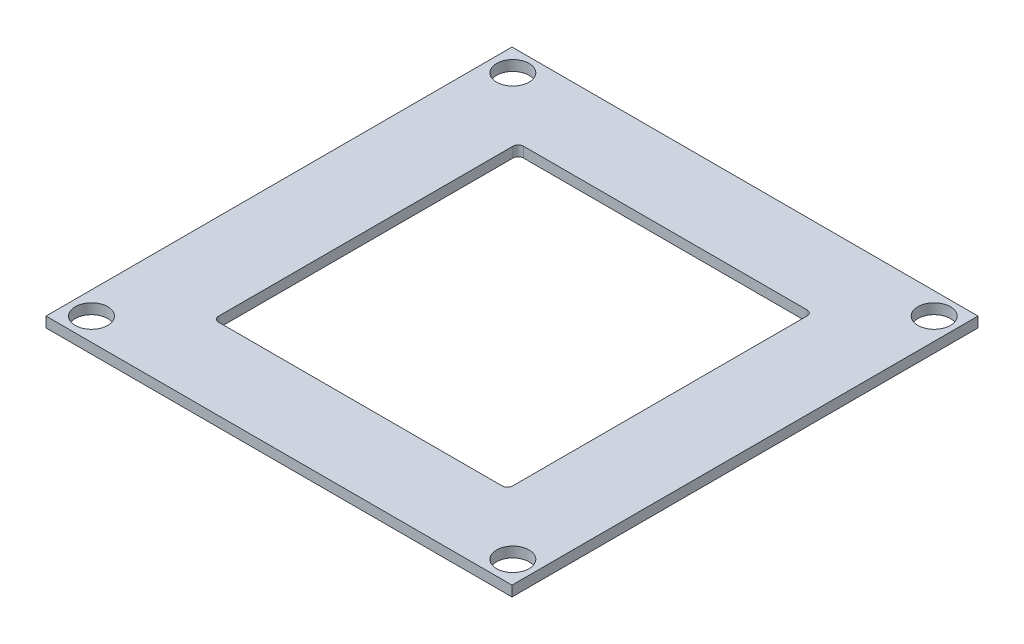
ISO-10303-21;
HEADER;
FILE_DESCRIPTION(('STEP AP214'),'2;1');
FILE_NAME('part.step','',(''),(''),'','','');
FILE_SCHEMA(('AUTOMOTIVE_DESIGN { 1 0 10303 214 1 1 1 1 }'));
ENDSEC;
DATA;
#1=APPLICATION_CONTEXT('core data for automotive mechanical design processes');
#2=APPLICATION_PROTOCOL_DEFINITION('international standard','automotive_design',2000,#1);
#3=PRODUCT_CONTEXT('',#1,'mechanical');
#4=PRODUCT('Part','Part','',(#3));
#5=PRODUCT_RELATED_PRODUCT_CATEGORY('part','',(#4));
#6=PRODUCT_DEFINITION_FORMATION('','',#4);
#7=PRODUCT_DEFINITION_CONTEXT('part definition',#1,'design');
#8=PRODUCT_DEFINITION('design','',#6,#7);
#9=PRODUCT_DEFINITION_SHAPE('','',#8);
#10=(LENGTH_UNIT() NAMED_UNIT(*) SI_UNIT(.MILLI.,.METRE.));
#11=(NAMED_UNIT(*) PLANE_ANGLE_UNIT() SI_UNIT($,.RADIAN.));
#12=(NAMED_UNIT(*) SI_UNIT($,.STERADIAN.) SOLID_ANGLE_UNIT());
#13=UNCERTAINTY_MEASURE_WITH_UNIT(LENGTH_MEASURE(1.E-05),#10,'distance_accuracy_value','');
#14=(GEOMETRIC_REPRESENTATION_CONTEXT(3) GLOBAL_UNCERTAINTY_ASSIGNED_CONTEXT((#13)) GLOBAL_UNIT_ASSIGNED_CONTEXT((#10,
#11,#12)) REPRESENTATION_CONTEXT('',''));
#15=CARTESIAN_POINT('',(0.,0.,0.));
#16=DIRECTION('',(0.,0.,1.));
#17=DIRECTION('',(1.,0.,0.));
#18=AXIS2_PLACEMENT_3D('',#15,#16,#17);
#19=CARTESIAN_POINT('',(0.,6.35,143.395999974));
#20=DIRECTION('',(1.,0.,0.));
#21=DIRECTION('',(0.,0.,-1.));
#22=AXIS2_PLACEMENT_3D('',#19,#20,#21);
#23=PLANE('',#22);
#24=DIRECTION('',(0.,0.,1.));
#25=VECTOR('',#24,1.);
#26=CARTESIAN_POINT('',(0.,0.,143.395999974));
#27=LINE('',#26,#25);
#28=CARTESIAN_POINT('',(0.,0.,-143.395999974));
#29=VERTEX_POINT('',#28);
#30=CARTESIAN_POINT('',(0.,0.,143.395999974));
#31=VERTEX_POINT('',#30);
#32=EDGE_CURVE('E155',#29,#31,#27,.T.);
#33=ORIENTED_EDGE('',*,*,#32,.T.);
#34=DIRECTION('',(0.,-1.,0.));
#35=VECTOR('',#34,1.);
#36=CARTESIAN_POINT('',(0.,6.35,143.395999974));
#37=LINE('',#36,#35);
#38=CARTESIAN_POINT('',(0.,6.35,143.395999974));
#39=VERTEX_POINT('',#38);
#40=EDGE_CURVE('E134',#39,#31,#37,.T.);
#41=ORIENTED_EDGE('',*,*,#40,.F.);
#42=DIRECTION('',(0.,0.,1.));
#43=VECTOR('',#42,1.);
#44=CARTESIAN_POINT('',(0.,6.35,143.395999974));
#45=LINE('',#44,#43);
#46=CARTESIAN_POINT('',(0.,6.35,-143.395999974));
#47=VERTEX_POINT('',#46);
#48=EDGE_CURVE('E142',#47,#39,#45,.T.);
#49=ORIENTED_EDGE('',*,*,#48,.F.);
#50=DIRECTION('',(0.,-1.,0.));
#51=VECTOR('',#50,1.);
#52=CARTESIAN_POINT('',(0.,6.35,-143.395999974));
#53=LINE('',#52,#51);
#54=EDGE_CURVE('E269',#47,#29,#53,.T.);
#55=ORIENTED_EDGE('',*,*,#54,.T.);
#56=EDGE_LOOP('',(#33,#41,#49,#55));
#57=FACE_BOUND('',#56,.T.);
#58=ADVANCED_FACE('F39',(#57),#23,.F.);
#59=CARTESIAN_POINT('',(0.,6.35,143.395999974));
#60=DIRECTION('',(0.,0.,-1.));
#61=DIRECTION('',(-1.,0.,0.));
#62=AXIS2_PLACEMENT_3D('',#59,#60,#61);
#63=PLANE('',#62);
#64=DIRECTION('',(1.,0.,0.));
#65=VECTOR('',#64,1.);
#66=CARTESIAN_POINT('',(0.,0.,143.395999974));
#67=LINE('',#66,#65);
#68=CARTESIAN_POINT('',(286.791999948,0.,143.395999974));
#69=VERTEX_POINT('',#68);
#70=EDGE_CURVE('E272',#31,#69,#67,.T.);
#71=ORIENTED_EDGE('',*,*,#70,.T.);
#72=DIRECTION('',(0.,-1.,0.));
#73=VECTOR('',#72,1.);
#74=CARTESIAN_POINT('',(286.791999948,6.35,143.395999974));
#75=LINE('',#74,#73);
#76=CARTESIAN_POINT('',(286.791999948,6.35,143.395999974));
#77=VERTEX_POINT('',#76);
#78=EDGE_CURVE('E137',#77,#69,#75,.T.);
#79=ORIENTED_EDGE('',*,*,#78,.F.);
#80=DIRECTION('',(1.,0.,0.));
#81=VECTOR('',#80,1.);
#82=CARTESIAN_POINT('',(0.,6.35,143.395999974));
#83=LINE('',#82,#81);
#84=EDGE_CURVE('E130',#39,#77,#83,.T.);
#85=ORIENTED_EDGE('',*,*,#84,.F.);
#86=ORIENTED_EDGE('',*,*,#40,.T.);
#87=EDGE_LOOP('',(#71,#79,#85,#86));
#88=FACE_BOUND('',#87,.T.);
#89=ADVANCED_FACE('F132',(#88),#63,.F.);
#90=CARTESIAN_POINT('',(286.791999948,6.35,143.395999974));
#91=DIRECTION('',(-1.,0.,0.));
#92=DIRECTION('',(0.,0.,1.));
#93=AXIS2_PLACEMENT_3D('',#90,#91,#92);
#94=PLANE('',#93);
#95=DIRECTION('',(0.,0.,-1.));
#96=VECTOR('',#95,1.);
#97=CARTESIAN_POINT('',(286.791999948,0.,143.395999974));
#98=LINE('',#97,#96);
#99=CARTESIAN_POINT('',(286.791999948,0.,-143.395999974));
#100=VERTEX_POINT('',#99);
#101=EDGE_CURVE('E275',#69,#100,#98,.T.);
#102=ORIENTED_EDGE('',*,*,#101,.T.);
#103=DIRECTION('',(0.,-1.,0.));
#104=VECTOR('',#103,1.);
#105=CARTESIAN_POINT('',(286.791999948,6.35,-143.395999974));
#106=LINE('',#105,#104);
#107=CARTESIAN_POINT('',(286.791999948,6.35,-143.395999974));
#108=VERTEX_POINT('',#107);
#109=EDGE_CURVE('E163',#108,#100,#106,.T.);
#110=ORIENTED_EDGE('',*,*,#109,.F.);
#111=DIRECTION('',(0.,0.,-1.));
#112=VECTOR('',#111,1.);
#113=CARTESIAN_POINT('',(286.791999948,6.35,143.395999974));
#114=LINE('',#113,#112);
#115=EDGE_CURVE('E141',#77,#108,#114,.T.);
#116=ORIENTED_EDGE('',*,*,#115,.F.);
#117=ORIENTED_EDGE('',*,*,#78,.T.);
#118=EDGE_LOOP('',(#102,#110,#116,#117));
#119=FACE_BOUND('',#118,.T.);
#120=ADVANCED_FACE('F290',(#119),#94,.F.);
#121=CARTESIAN_POINT('',(0.,6.35,-143.395999974));
#122=DIRECTION('',(0.,0.,1.));
#123=DIRECTION('',(1.,0.,0.));
#124=AXIS2_PLACEMENT_3D('',#121,#122,#123);
#125=PLANE('',#124);
#126=DIRECTION('',(-1.,0.,0.));
#127=VECTOR('',#126,1.);
#128=CARTESIAN_POINT('',(0.,0.,-143.395999974));
#129=LINE('',#128,#127);
#130=EDGE_CURVE('E152',#100,#29,#129,.T.);
#131=ORIENTED_EDGE('',*,*,#130,.T.);
#132=ORIENTED_EDGE('',*,*,#54,.F.);
#133=DIRECTION('',(-1.,0.,0.));
#134=VECTOR('',#133,1.);
#135=CARTESIAN_POINT('',(0.,6.35,-143.395999974));
#136=LINE('',#135,#134);
#137=EDGE_CURVE('E147',#108,#47,#136,.T.);
#138=ORIENTED_EDGE('',*,*,#137,.F.);
#139=ORIENTED_EDGE('',*,*,#109,.T.);
#140=EDGE_LOOP('',(#131,#132,#138,#139));
#141=FACE_BOUND('',#140,.T.);
#142=ADVANCED_FACE('F286',(#141),#125,.F.);
#143=CARTESIAN_POINT('',(0.,6.35,0.));
#144=DIRECTION('',(0.,-1.,0.));
#145=DIRECTION('',(0.,0.,-1.));
#146=AXIS2_PLACEMENT_3D('',#143,#144,#145);
#147=PLANE('',#146);
#148=DIRECTION('',(0.,0.,1.));
#149=VECTOR('',#148,1.);
#150=CARTESIAN_POINT('',(234.139965981564,6.35,93.569716007567));
#151=LINE('',#150,#149);
#152=CARTESIAN_POINT('',(234.139965981564,6.35,-90.9027160075705));
#153=VERTEX_POINT('',#152);
#154=CARTESIAN_POINT('',(234.139965981564,6.35,90.394716007567));
#155=VERTEX_POINT('',#154);
#156=EDGE_CURVE('E237',#153,#155,#151,.T.);
#157=ORIENTED_EDGE('',*,*,#156,.T.);
#158=CARTESIAN_POINT('',(230.964965981564,6.35,90.394716007567));
#159=DIRECTION('',(0.,-1.,0.));
#160=DIRECTION('',(0.,0.,-1.));
#161=AXIS2_PLACEMENT_3D('',#158,#159,#160);
#162=CIRCLE('',#161,3.175);
#163=CARTESIAN_POINT('',(230.964965981564,6.35,93.569716007567));
#164=VERTEX_POINT('',#163);
#165=EDGE_CURVE('E62',#155,#164,#162,.T.);
#166=ORIENTED_EDGE('',*,*,#165,.T.);
#167=DIRECTION('',(-1.,0.,0.));
#168=VECTOR('',#167,1.);
#169=CARTESIAN_POINT('',(234.139965981564,6.35,93.569716007567));
#170=LINE('',#169,#168);
#171=CARTESIAN_POINT('',(56.3350339664346,6.35,93.569716007567));
#172=VERTEX_POINT('',#171);
#173=EDGE_CURVE('E228',#164,#172,#170,.T.);
#174=ORIENTED_EDGE('',*,*,#173,.T.);
#175=CARTESIAN_POINT('',(56.3350339664345,6.35,90.394716007567));
#176=DIRECTION('',(0.,-1.,0.));
#177=DIRECTION('',(0.,0.,-1.));
#178=AXIS2_PLACEMENT_3D('',#175,#176,#177);
#179=CIRCLE('',#178,3.175);
#180=CARTESIAN_POINT('',(53.1600339664345,6.35,90.394716007567));
#181=VERTEX_POINT('',#180);
#182=EDGE_CURVE('E11',#172,#181,#179,.T.);
#183=ORIENTED_EDGE('',*,*,#182,.T.);
#184=DIRECTION('',(0.,0.,-1.));
#185=VECTOR('',#184,1.);
#186=CARTESIAN_POINT('',(53.1600339664345,6.35,93.569716007567));
#187=LINE('',#186,#185);
#188=CARTESIAN_POINT('',(53.1600339664345,6.35,-90.9027160075705));
#189=VERTEX_POINT('',#188);
#190=EDGE_CURVE('E220',#181,#189,#187,.T.);
#191=ORIENTED_EDGE('',*,*,#190,.T.);
#192=CARTESIAN_POINT('',(56.3350339664346,6.35,-90.9027160075704));
#193=DIRECTION('',(0.,-1.,0.));
#194=DIRECTION('',(0.,0.,-1.));
#195=AXIS2_PLACEMENT_3D('',#192,#193,#194);
#196=CIRCLE('',#195,3.175);
#197=CARTESIAN_POINT('',(56.3350339664346,6.35,-94.0777160075704));
#198=VERTEX_POINT('',#197);
#199=EDGE_CURVE('E193',#189,#198,#196,.T.);
#200=ORIENTED_EDGE('',*,*,#199,.T.);
#201=DIRECTION('',(1.,0.,0.));
#202=VECTOR('',#201,1.);
#203=CARTESIAN_POINT('',(234.139965981564,6.35,-94.0777160075704));
#204=LINE('',#203,#202);
#205=CARTESIAN_POINT('',(230.964965981564,6.35,-94.0777160075704));
#206=VERTEX_POINT('',#205);
#207=EDGE_CURVE('E233',#198,#206,#204,.T.);
#208=ORIENTED_EDGE('',*,*,#207,.T.);
#209=CARTESIAN_POINT('',(230.964965981564,6.35,-90.9027160075705));
#210=DIRECTION('',(0.,-1.,0.));
#211=DIRECTION('',(0.,0.,-1.));
#212=AXIS2_PLACEMENT_3D('',#209,#210,#211);
#213=CIRCLE('',#212,3.175);
#214=EDGE_CURVE('E199',#206,#153,#213,.T.);
#215=ORIENTED_EDGE('',*,*,#214,.T.);
#216=EDGE_LOOP('',(#157,#166,#174,#183,#191,#200,#208,#215));
#217=FACE_BOUND('',#216,.T.);
#218=CARTESIAN_POINT('',(273.299999947994,6.35,129.395999974));
#219=DIRECTION('',(0.,-1.,0.));
#220=DIRECTION('',(0.,0.,-1.));
#221=AXIS2_PLACEMENT_3D('',#218,#219,#220);
#222=CIRCLE('',#221,9.99999999999998);
#223=CARTESIAN_POINT('',(273.299999947994,6.35,119.395999974));
#224=VERTEX_POINT('',#223);
#225=EDGE_CURVE('E463',#224,#224,#222,.T.);
#226=ORIENTED_EDGE('',*,*,#225,.T.);
#227=EDGE_LOOP('',(#226));
#228=FACE_BOUND('',#227,.T.);
#229=CARTESIAN_POINT('',(13.9999999999966,6.35,129.395999973995));
#230=DIRECTION('',(0.,-1.,0.));
#231=DIRECTION('',(0.,0.,-1.));
#232=AXIS2_PLACEMENT_3D('',#229,#230,#231);
#233=CIRCLE('',#232,9.99999999999651);
#234=CARTESIAN_POINT('',(13.9999999999966,6.35,119.395999973999));
#235=VERTEX_POINT('',#234);
#236=EDGE_CURVE('E471',#235,#235,#233,.T.);
#237=ORIENTED_EDGE('',*,*,#236,.T.);
#238=EDGE_LOOP('',(#237));
#239=FACE_BOUND('',#238,.T.);
#240=CARTESIAN_POINT('',(14.0000000000022,6.35,-129.903999974005));
#241=DIRECTION('',(0.,-1.,0.));
#242=DIRECTION('',(0.,0.,-1.));
#243=AXIS2_PLACEMENT_3D('',#240,#241,#242);
#244=CIRCLE('',#243,9.99999999999718);
#245=CARTESIAN_POINT('',(14.0000000000022,6.35,-139.903999974002));
#246=VERTEX_POINT('',#245);
#247=EDGE_CURVE('E263',#246,#246,#244,.T.);
#248=ORIENTED_EDGE('',*,*,#247,.T.);
#249=EDGE_LOOP('',(#248));
#250=FACE_BOUND('',#249,.T.);
#251=CARTESIAN_POINT('',(273.299999948002,6.35,-129.903999973999));
#252=DIRECTION('',(0.,-1.,0.));
#253=DIRECTION('',(0.,0.,-1.));
#254=AXIS2_PLACEMENT_3D('',#251,#252,#253);
#255=CIRCLE('',#254,10.);
#256=CARTESIAN_POINT('',(273.299999948002,6.35,-139.903999973999));
#257=VERTEX_POINT('',#256);
#258=EDGE_CURVE('E256',#257,#257,#255,.T.);
#259=ORIENTED_EDGE('',*,*,#258,.T.);
#260=EDGE_LOOP('',(#259));
#261=FACE_BOUND('',#260,.T.);
#262=ORIENTED_EDGE('',*,*,#48,.T.);
#263=ORIENTED_EDGE('',*,*,#84,.T.);
#264=ORIENTED_EDGE('',*,*,#115,.T.);
#265=ORIENTED_EDGE('',*,*,#137,.T.);
#266=EDGE_LOOP('',(#262,#263,#264,#265));
#267=FACE_BOUND('',#266,.T.);
#268=ADVANCED_FACE('F145',(#217,#228,#239,#250,#261,#267),#147,.F.);
#269=CARTESIAN_POINT('',(0.,0.,0.));
#270=DIRECTION('',(0.,-1.,0.));
#271=DIRECTION('',(0.,0.,-1.));
#272=AXIS2_PLACEMENT_3D('',#269,#270,#271);
#273=PLANE('',#272);
#274=DIRECTION('',(0.,0.,-1.));
#275=VECTOR('',#274,1.);
#276=CARTESIAN_POINT('',(53.1600339664345,0.,93.569716007567));
#277=LINE('',#276,#275);
#278=CARTESIAN_POINT('',(53.1600339664345,0.,90.394716007567));
#279=VERTEX_POINT('',#278);
#280=CARTESIAN_POINT('',(53.1600339664345,0.,-90.9027160075705));
#281=VERTEX_POINT('',#280);
#282=EDGE_CURVE('E214',#279,#281,#277,.T.);
#283=ORIENTED_EDGE('',*,*,#282,.F.);
#284=CARTESIAN_POINT('',(56.3350339664345,0.,90.394716007567));
#285=DIRECTION('',(0.,-1.,0.));
#286=DIRECTION('',(0.,0.,-1.));
#287=AXIS2_PLACEMENT_3D('',#284,#285,#286);
#288=CIRCLE('',#287,3.175);
#289=CARTESIAN_POINT('',(56.3350339664346,0.,93.569716007567));
#290=VERTEX_POINT('',#289);
#291=EDGE_CURVE('E48',#279,#290,#288,.F.);
#292=ORIENTED_EDGE('',*,*,#291,.T.);
#293=DIRECTION('',(-1.,0.,0.));
#294=VECTOR('',#293,1.);
#295=CARTESIAN_POINT('',(234.139965981564,0.,93.569716007567));
#296=LINE('',#295,#294);
#297=CARTESIAN_POINT('',(230.964965981564,0.,93.569716007567));
#298=VERTEX_POINT('',#297);
#299=EDGE_CURVE('E212',#298,#290,#296,.T.);
#300=ORIENTED_EDGE('',*,*,#299,.F.);
#301=CARTESIAN_POINT('',(230.964965981564,0.,90.394716007567));
#302=DIRECTION('',(0.,-1.,0.));
#303=DIRECTION('',(0.,0.,-1.));
#304=AXIS2_PLACEMENT_3D('',#301,#302,#303);
#305=CIRCLE('',#304,3.175);
#306=CARTESIAN_POINT('',(234.139965981564,0.,90.394716007567));
#307=VERTEX_POINT('',#306);
#308=EDGE_CURVE('E202',#298,#307,#305,.F.);
#309=ORIENTED_EDGE('',*,*,#308,.T.);
#310=DIRECTION('',(0.,0.,1.));
#311=VECTOR('',#310,1.);
#312=CARTESIAN_POINT('',(234.139965981564,0.,93.569716007567));
#313=LINE('',#312,#311);
#314=CARTESIAN_POINT('',(234.139965981564,0.,-90.9027160075705));
#315=VERTEX_POINT('',#314);
#316=EDGE_CURVE('E221',#315,#307,#313,.T.);
#317=ORIENTED_EDGE('',*,*,#316,.F.);
#318=CARTESIAN_POINT('',(230.964965981564,0.,-90.9027160075705));
#319=DIRECTION('',(0.,-1.,0.));
#320=DIRECTION('',(0.,0.,-1.));
#321=AXIS2_PLACEMENT_3D('',#318,#319,#320);
#322=CIRCLE('',#321,3.175);
#323=CARTESIAN_POINT('',(230.964965981564,0.,-94.0777160075704));
#324=VERTEX_POINT('',#323);
#325=EDGE_CURVE('E196',#315,#324,#322,.F.);
#326=ORIENTED_EDGE('',*,*,#325,.T.);
#327=DIRECTION('',(1.,0.,0.));
#328=VECTOR('',#327,1.);
#329=CARTESIAN_POINT('',(234.139965981564,0.,-94.0777160075704));
#330=LINE('',#329,#328);
#331=CARTESIAN_POINT('',(56.3350339664346,0.,-94.0777160075704));
#332=VERTEX_POINT('',#331);
#333=EDGE_CURVE('E249',#332,#324,#330,.T.);
#334=ORIENTED_EDGE('',*,*,#333,.F.);
#335=CARTESIAN_POINT('',(56.3350339664346,0.,-90.9027160075704));
#336=DIRECTION('',(0.,-1.,0.));
#337=DIRECTION('',(0.,0.,-1.));
#338=AXIS2_PLACEMENT_3D('',#335,#336,#337);
#339=CIRCLE('',#338,3.175);
#340=EDGE_CURVE('E190',#332,#281,#339,.F.);
#341=ORIENTED_EDGE('',*,*,#340,.T.);
#342=EDGE_LOOP('',(#283,#292,#300,#309,#317,#326,#334,#341));
#343=FACE_BOUND('',#342,.T.);
#344=CARTESIAN_POINT('',(273.299999947994,0.,129.395999974));
#345=DIRECTION('',(0.,-1.,0.));
#346=DIRECTION('',(0.,0.,-1.));
#347=AXIS2_PLACEMENT_3D('',#344,#345,#346);
#348=CIRCLE('',#347,9.99999999999998);
#349=CARTESIAN_POINT('',(273.299999947994,0.,119.395999974));
#350=VERTEX_POINT('',#349);
#351=EDGE_CURVE('E240',#350,#350,#348,.T.);
#352=ORIENTED_EDGE('',*,*,#351,.F.);
#353=EDGE_LOOP('',(#352));
#354=FACE_BOUND('',#353,.T.);
#355=CARTESIAN_POINT('',(13.9999999999966,0.,129.395999973995));
#356=DIRECTION('',(0.,-1.,0.));
#357=DIRECTION('',(0.,0.,-1.));
#358=AXIS2_PLACEMENT_3D('',#355,#356,#357);
#359=CIRCLE('',#358,9.99999999999651);
#360=CARTESIAN_POINT('',(13.9999999999966,0.,119.395999973999));
#361=VERTEX_POINT('',#360);
#362=EDGE_CURVE('E468',#361,#361,#359,.T.);
#363=ORIENTED_EDGE('',*,*,#362,.F.);
#364=EDGE_LOOP('',(#363));
#365=FACE_BOUND('',#364,.T.);
#366=CARTESIAN_POINT('',(14.0000000000022,0.,-129.903999974005));
#367=DIRECTION('',(0.,-1.,0.));
#368=DIRECTION('',(0.,0.,-1.));
#369=AXIS2_PLACEMENT_3D('',#366,#367,#368);
#370=CIRCLE('',#369,9.99999999999718);
#371=CARTESIAN_POINT('',(14.0000000000022,0.,-139.903999974002));
#372=VERTEX_POINT('',#371);
#373=EDGE_CURVE('E477',#372,#372,#370,.T.);
#374=ORIENTED_EDGE('',*,*,#373,.F.);
#375=EDGE_LOOP('',(#374));
#376=FACE_BOUND('',#375,.T.);
#377=CARTESIAN_POINT('',(273.299999948002,0.,-129.903999973999));
#378=DIRECTION('',(0.,-1.,0.));
#379=DIRECTION('',(0.,0.,-1.));
#380=AXIS2_PLACEMENT_3D('',#377,#378,#379);
#381=CIRCLE('',#380,10.);
#382=CARTESIAN_POINT('',(273.299999948002,0.,-139.903999973999));
#383=VERTEX_POINT('',#382);
#384=EDGE_CURVE('E260',#383,#383,#381,.T.);
#385=ORIENTED_EDGE('',*,*,#384,.F.);
#386=EDGE_LOOP('',(#385));
#387=FACE_BOUND('',#386,.T.);
#388=ORIENTED_EDGE('',*,*,#32,.F.);
#389=ORIENTED_EDGE('',*,*,#130,.F.);
#390=ORIENTED_EDGE('',*,*,#101,.F.);
#391=ORIENTED_EDGE('',*,*,#70,.F.);
#392=EDGE_LOOP('',(#388,#389,#390,#391));
#393=FACE_BOUND('',#392,.T.);
#394=ADVANCED_FACE('F210',(#343,#354,#365,#376,#387,#393),#273,.T.);
#395=CARTESIAN_POINT('',(273.299999948002,6.35,-129.903999973999));
#396=DIRECTION('',(0.,-1.,0.));
#397=DIRECTION('',(0.,0.,-1.));
#398=AXIS2_PLACEMENT_3D('',#395,#396,#397);
#399=CYLINDRICAL_SURFACE('',#398,10.);
#400=ORIENTED_EDGE('',*,*,#258,.F.);
#401=EDGE_LOOP('',(#400));
#402=FACE_BOUND('',#401,.T.);
#403=ORIENTED_EDGE('',*,*,#384,.T.);
#404=EDGE_LOOP('',(#403));
#405=FACE_BOUND('',#404,.T.);
#406=ADVANCED_FACE('F341',(#402,#405),#399,.F.);
#407=CARTESIAN_POINT('',(14.0000000000022,6.35,-129.903999974005));
#408=DIRECTION('',(0.,-1.,0.));
#409=DIRECTION('',(0.,0.,-1.));
#410=AXIS2_PLACEMENT_3D('',#407,#408,#409);
#411=CYLINDRICAL_SURFACE('',#410,9.99999999999718);
#412=ORIENTED_EDGE('',*,*,#247,.F.);
#413=EDGE_LOOP('',(#412));
#414=FACE_BOUND('',#413,.T.);
#415=ORIENTED_EDGE('',*,*,#373,.T.);
#416=EDGE_LOOP('',(#415));
#417=FACE_BOUND('',#416,.T.);
#418=ADVANCED_FACE('F344',(#414,#417),#411,.F.);
#419=CARTESIAN_POINT('',(13.9999999999966,6.35,129.395999973995));
#420=DIRECTION('',(0.,-1.,0.));
#421=DIRECTION('',(0.,0.,-1.));
#422=AXIS2_PLACEMENT_3D('',#419,#420,#421);
#423=CYLINDRICAL_SURFACE('',#422,9.99999999999651);
#424=ORIENTED_EDGE('',*,*,#236,.F.);
#425=EDGE_LOOP('',(#424));
#426=FACE_BOUND('',#425,.T.);
#427=ORIENTED_EDGE('',*,*,#362,.T.);
#428=EDGE_LOOP('',(#427));
#429=FACE_BOUND('',#428,.T.);
#430=ADVANCED_FACE('F365',(#426,#429),#423,.F.);
#431=CARTESIAN_POINT('',(273.299999947994,6.35,129.395999974));
#432=DIRECTION('',(0.,-1.,0.));
#433=DIRECTION('',(0.,0.,-1.));
#434=AXIS2_PLACEMENT_3D('',#431,#432,#433);
#435=CYLINDRICAL_SURFACE('',#434,9.99999999999998);
#436=ORIENTED_EDGE('',*,*,#225,.F.);
#437=EDGE_LOOP('',(#436));
#438=FACE_BOUND('',#437,.T.);
#439=ORIENTED_EDGE('',*,*,#351,.T.);
#440=EDGE_LOOP('',(#439));
#441=FACE_BOUND('',#440,.T.);
#442=ADVANCED_FACE('F340',(#438,#441),#435,.F.);
#443=CARTESIAN_POINT('',(53.1600339664345,6.35,93.569716007567));
#444=DIRECTION('',(-1.,0.,0.));
#445=DIRECTION('',(0.,0.,1.));
#446=AXIS2_PLACEMENT_3D('',#443,#444,#445);
#447=PLANE('',#446);
#448=ORIENTED_EDGE('',*,*,#282,.T.);
#449=DIRECTION('',(0.,-1.,0.));
#450=VECTOR('',#449,1.);
#451=CARTESIAN_POINT('',(53.1600339664345,6.35,-90.9027160075704));
#452=LINE('',#451,#450);
#453=EDGE_CURVE('E174',#281,#189,#452,.F.);
#454=ORIENTED_EDGE('',*,*,#453,.T.);
#455=ORIENTED_EDGE('',*,*,#190,.F.);
#456=DIRECTION('',(0.,-1.,0.));
#457=VECTOR('',#456,1.);
#458=CARTESIAN_POINT('',(53.1600339664345,0.,90.394716007567));
#459=LINE('',#458,#457);
#460=EDGE_CURVE('E170',#181,#279,#459,.T.);
#461=ORIENTED_EDGE('',*,*,#460,.T.);
#462=EDGE_LOOP('',(#448,#454,#455,#461));
#463=FACE_BOUND('',#462,.T.);
#464=ADVANCED_FACE('F230',(#463),#447,.F.);
#465=CARTESIAN_POINT('',(234.139965981564,6.35,93.569716007567));
#466=DIRECTION('',(0.,0.,1.));
#467=DIRECTION('',(1.,0.,0.));
#468=AXIS2_PLACEMENT_3D('',#465,#466,#467);
#469=PLANE('',#468);
#470=ORIENTED_EDGE('',*,*,#173,.F.);
#471=DIRECTION('',(0.,-1.,0.));
#472=VECTOR('',#471,1.);
#473=CARTESIAN_POINT('',(230.964965981564,0.,93.569716007567));
#474=LINE('',#473,#472);
#475=EDGE_CURVE('E186',#164,#298,#474,.T.);
#476=ORIENTED_EDGE('',*,*,#475,.T.);
#477=ORIENTED_EDGE('',*,*,#299,.T.);
#478=DIRECTION('',(0.,-1.,0.));
#479=VECTOR('',#478,1.);
#480=CARTESIAN_POINT('',(56.3350339664345,6.35,93.569716007567));
#481=LINE('',#480,#479);
#482=EDGE_CURVE('E55',#290,#172,#481,.F.);
#483=ORIENTED_EDGE('',*,*,#482,.T.);
#484=EDGE_LOOP('',(#470,#476,#477,#483));
#485=FACE_BOUND('',#484,.T.);
#486=ADVANCED_FACE('F217',(#485),#469,.F.);
#487=CARTESIAN_POINT('',(234.139965981564,6.35,93.569716007567));
#488=DIRECTION('',(1.,0.,0.));
#489=DIRECTION('',(0.,0.,-1.));
#490=AXIS2_PLACEMENT_3D('',#487,#488,#489);
#491=PLANE('',#490);
#492=ORIENTED_EDGE('',*,*,#156,.F.);
#493=DIRECTION('',(0.,-1.,0.));
#494=VECTOR('',#493,1.);
#495=CARTESIAN_POINT('',(234.139965981564,0.,-90.9027160075705));
#496=LINE('',#495,#494);
#497=EDGE_CURVE('E180',#153,#315,#496,.T.);
#498=ORIENTED_EDGE('',*,*,#497,.T.);
#499=ORIENTED_EDGE('',*,*,#316,.T.);
#500=DIRECTION('',(0.,-1.,0.));
#501=VECTOR('',#500,1.);
#502=CARTESIAN_POINT('',(234.139965981564,6.35,90.394716007567));
#503=LINE('',#502,#501);
#504=EDGE_CURVE('E177',#307,#155,#503,.F.);
#505=ORIENTED_EDGE('',*,*,#504,.T.);
#506=EDGE_LOOP('',(#492,#498,#499,#505));
#507=FACE_BOUND('',#506,.T.);
#508=ADVANCED_FACE('F322',(#507),#491,.F.);
#509=CARTESIAN_POINT('',(234.139965981564,6.35,-94.0777160075704));
#510=DIRECTION('',(0.,0.,-1.));
#511=DIRECTION('',(-1.,0.,0.));
#512=AXIS2_PLACEMENT_3D('',#509,#510,#511);
#513=PLANE('',#512);
#514=ORIENTED_EDGE('',*,*,#207,.F.);
#515=DIRECTION('',(0.,-1.,0.));
#516=VECTOR('',#515,1.);
#517=CARTESIAN_POINT('',(56.3350339664346,0.,-94.0777160075704));
#518=LINE('',#517,#516);
#519=EDGE_CURVE('E161',#198,#332,#518,.T.);
#520=ORIENTED_EDGE('',*,*,#519,.T.);
#521=ORIENTED_EDGE('',*,*,#333,.T.);
#522=DIRECTION('',(0.,-1.,0.));
#523=VECTOR('',#522,1.);
#524=CARTESIAN_POINT('',(230.964965981564,6.35,-94.0777160075704));
#525=LINE('',#524,#523);
#526=EDGE_CURVE('E157',#324,#206,#525,.F.);
#527=ORIENTED_EDGE('',*,*,#526,.T.);
#528=EDGE_LOOP('',(#514,#520,#521,#527));
#529=FACE_BOUND('',#528,.T.);
#530=ADVANCED_FACE('F308',(#529),#513,.F.);
#531=CARTESIAN_POINT('',(56.3350339664346,6.35,-90.9027160075704));
#532=DIRECTION('',(0.,1.,0.));
#533=DIRECTION('',(0.,0.,1.));
#534=AXIS2_PLACEMENT_3D('',#531,#532,#533);
#535=CYLINDRICAL_SURFACE('',#534,3.175);
#536=ORIENTED_EDGE('',*,*,#199,.F.);
#537=ORIENTED_EDGE('',*,*,#453,.F.);
#538=ORIENTED_EDGE('',*,*,#340,.F.);
#539=ORIENTED_EDGE('',*,*,#519,.F.);
#540=EDGE_LOOP('',(#536,#537,#538,#539));
#541=FACE_BOUND('',#540,.T.);
#542=ADVANCED_FACE('F304',(#541),#535,.F.);
#543=CARTESIAN_POINT('',(230.964965981564,6.35,-90.9027160075705));
#544=DIRECTION('',(0.,1.,0.));
#545=DIRECTION('',(0.,0.,1.));
#546=AXIS2_PLACEMENT_3D('',#543,#544,#545);
#547=CYLINDRICAL_SURFACE('',#546,3.175);
#548=ORIENTED_EDGE('',*,*,#214,.F.);
#549=ORIENTED_EDGE('',*,*,#526,.F.);
#550=ORIENTED_EDGE('',*,*,#325,.F.);
#551=ORIENTED_EDGE('',*,*,#497,.F.);
#552=EDGE_LOOP('',(#548,#549,#550,#551));
#553=FACE_BOUND('',#552,.T.);
#554=ADVANCED_FACE('F307',(#553),#547,.F.);
#555=CARTESIAN_POINT('',(230.964965981564,6.35,90.394716007567));
#556=DIRECTION('',(0.,1.,0.));
#557=DIRECTION('',(0.,0.,1.));
#558=AXIS2_PLACEMENT_3D('',#555,#556,#557);
#559=CYLINDRICAL_SURFACE('',#558,3.175);
#560=ORIENTED_EDGE('',*,*,#165,.F.);
#561=ORIENTED_EDGE('',*,*,#504,.F.);
#562=ORIENTED_EDGE('',*,*,#308,.F.);
#563=ORIENTED_EDGE('',*,*,#475,.F.);
#564=EDGE_LOOP('',(#560,#561,#562,#563));
#565=FACE_BOUND('',#564,.T.);
#566=ADVANCED_FACE('F311',(#565),#559,.F.);
#567=CARTESIAN_POINT('',(56.3350339664345,6.35,90.394716007567));
#568=DIRECTION('',(0.,1.,0.));
#569=DIRECTION('',(0.,0.,1.));
#570=AXIS2_PLACEMENT_3D('',#567,#568,#569);
#571=CYLINDRICAL_SURFACE('',#570,3.175);
#572=ORIENTED_EDGE('',*,*,#182,.F.);
#573=ORIENTED_EDGE('',*,*,#482,.F.);
#574=ORIENTED_EDGE('',*,*,#291,.F.);
#575=ORIENTED_EDGE('',*,*,#460,.F.);
#576=EDGE_LOOP('',(#572,#573,#574,#575));
#577=FACE_BOUND('',#576,.T.);
#578=ADVANCED_FACE('F41',(#577),#571,.F.);
#579=CLOSED_SHELL('',(#58,#89,#120,#142,#268,#394,#406,#418,#430,#442,#464,#486,#508,#530,#542,
#554,#566,#578));
#580=MANIFOLD_SOLID_BREP('B2',#579);
#581=ADVANCED_BREP_SHAPE_REPRESENTATION('',(#18,#580),#14);
#582=SHAPE_DEFINITION_REPRESENTATION(#9,#581);
ENDSEC;
END-ISO-10303-21;
